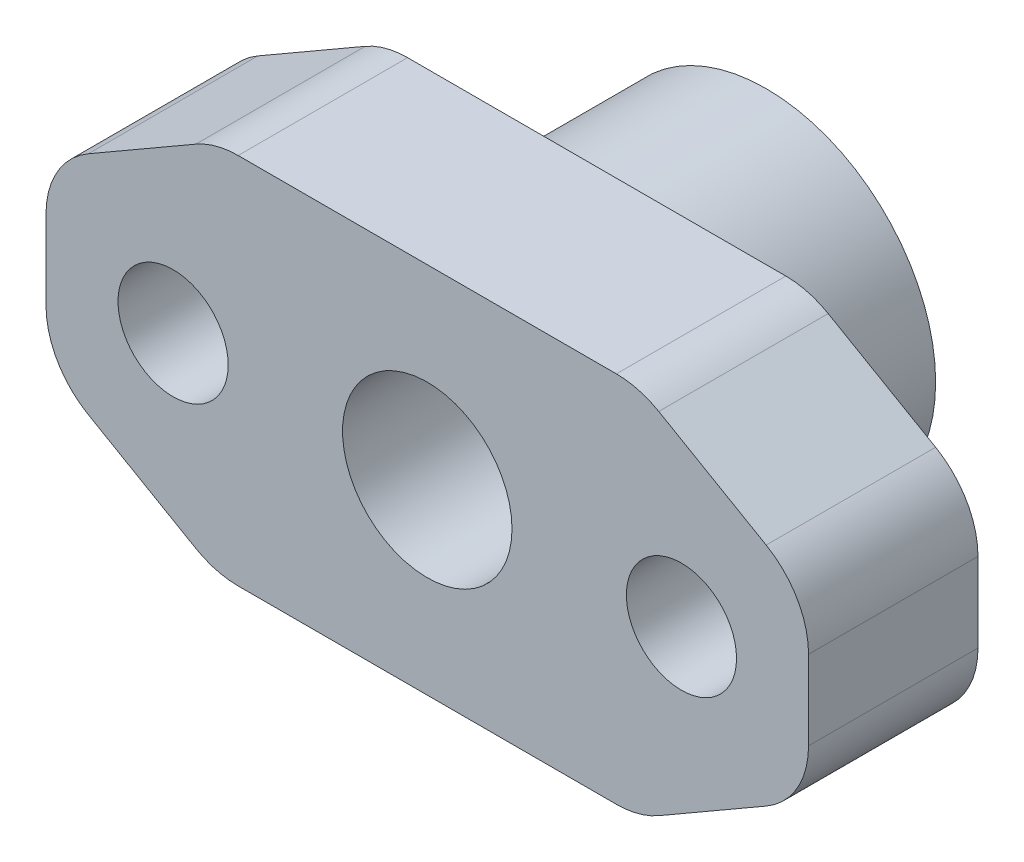
ISO-10303-21;
HEADER;
FILE_DESCRIPTION(('STEP AP214'),'2;1');
FILE_NAME('part.step','',(''),(''),'','','');
FILE_SCHEMA(('AUTOMOTIVE_DESIGN { 1 0 10303 214 1 1 1 1 }'));
ENDSEC;
DATA;
#1=APPLICATION_CONTEXT('core data for automotive mechanical design processes');
#2=APPLICATION_PROTOCOL_DEFINITION('international standard','automotive_design',2000,#1);
#3=PRODUCT_CONTEXT('',#1,'mechanical');
#4=PRODUCT('Part','Part','',(#3));
#5=PRODUCT_RELATED_PRODUCT_CATEGORY('part','',(#4));
#6=PRODUCT_DEFINITION_FORMATION('','',#4);
#7=PRODUCT_DEFINITION_CONTEXT('part definition',#1,'design');
#8=PRODUCT_DEFINITION('design','',#6,#7);
#9=PRODUCT_DEFINITION_SHAPE('','',#8);
#10=(LENGTH_UNIT() NAMED_UNIT(*) SI_UNIT(.MILLI.,.METRE.));
#11=(NAMED_UNIT(*) PLANE_ANGLE_UNIT() SI_UNIT($,.RADIAN.));
#12=(NAMED_UNIT(*) SI_UNIT($,.STERADIAN.) SOLID_ANGLE_UNIT());
#13=UNCERTAINTY_MEASURE_WITH_UNIT(LENGTH_MEASURE(1.E-05),#10,'distance_accuracy_value','');
#14=(GEOMETRIC_REPRESENTATION_CONTEXT(3) GLOBAL_UNCERTAINTY_ASSIGNED_CONTEXT((#13)) GLOBAL_UNIT_ASSIGNED_CONTEXT((#10,
#11,#12)) REPRESENTATION_CONTEXT('',''));
#15=CARTESIAN_POINT('',(0.,0.,0.));
#16=DIRECTION('',(0.,0.,1.));
#17=DIRECTION('',(1.,0.,0.));
#18=AXIS2_PLACEMENT_3D('',#15,#16,#17);
#19=CARTESIAN_POINT('',(0.,0.,20.));
#20=DIRECTION('',(0.,0.,-1.));
#21=DIRECTION('',(-1.,0.,0.));
#22=AXIS2_PLACEMENT_3D('',#19,#20,#21);
#23=CYLINDRICAL_SURFACE('',#22,10.);
#24=CARTESIAN_POINT('',(0.,0.,0.));
#25=DIRECTION('',(0.,0.,1.));
#26=DIRECTION('',(1.,0.,0.));
#27=AXIS2_PLACEMENT_3D('',#24,#25,#26);
#28=CIRCLE('',#27,10.);
#29=CARTESIAN_POINT('',(10.,0.,0.));
#30=VERTEX_POINT('',#29);
#31=EDGE_CURVE('E177',#30,#30,#28,.T.);
#32=ORIENTED_EDGE('',*,*,#31,.T.);
#33=EDGE_LOOP('',(#32));
#34=FACE_BOUND('',#33,.T.);
#35=CARTESIAN_POINT('',(0.,0.,10.));
#36=DIRECTION('',(0.,0.,1.));
#37=DIRECTION('',(1.,0.,0.));
#38=AXIS2_PLACEMENT_3D('',#35,#36,#37);
#39=CIRCLE('',#38,10.);
#40=CARTESIAN_POINT('',(10.,0.,10.));
#41=VERTEX_POINT('',#40);
#42=EDGE_CURVE('E172',#41,#41,#39,.T.);
#43=ORIENTED_EDGE('',*,*,#42,.F.);
#44=EDGE_LOOP('',(#43));
#45=FACE_BOUND('',#44,.T.);
#46=ADVANCED_FACE('F33',(#34,#45),#23,.T.);
#47=CARTESIAN_POINT('',(0.,0.,20.));
#48=DIRECTION('',(0.,0.,1.));
#49=DIRECTION('',(1.,0.,0.));
#50=AXIS2_PLACEMENT_3D('',#47,#48,#49);
#51=PLANE('',#50);
#52=CARTESIAN_POINT('',(15.,0.,20.));
#53=DIRECTION('',(0.,0.,1.));
#54=DIRECTION('',(1.,0.,0.));
#55=AXIS2_PLACEMENT_3D('',#52,#53,#54);
#56=CIRCLE('',#55,3.25);
#57=CARTESIAN_POINT('',(18.25,0.,20.));
#58=VERTEX_POINT('',#57);
#59=EDGE_CURVE('E251',#58,#58,#56,.T.);
#60=ORIENTED_EDGE('',*,*,#59,.F.);
#61=EDGE_LOOP('',(#60));
#62=FACE_BOUND('',#61,.T.);
#63=CARTESIAN_POINT('',(-15.,0.,20.));
#64=DIRECTION('',(0.,0.,1.));
#65=DIRECTION('',(1.,0.,0.));
#66=AXIS2_PLACEMENT_3D('',#63,#64,#65);
#67=CIRCLE('',#66,3.25);
#68=CARTESIAN_POINT('',(-11.75,0.,20.));
#69=VERTEX_POINT('',#68);
#70=EDGE_CURVE('E274',#69,#69,#67,.T.);
#71=ORIENTED_EDGE('',*,*,#70,.F.);
#72=EDGE_LOOP('',(#71));
#73=FACE_BOUND('',#72,.T.);
#74=CARTESIAN_POINT('',(0.,0.,20.));
#75=DIRECTION('',(0.,0.,1.));
#76=DIRECTION('',(1.,0.,0.));
#77=AXIS2_PLACEMENT_3D('',#74,#75,#76);
#78=CIRCLE('',#77,5.);
#79=CARTESIAN_POINT('',(5.,0.,20.));
#80=VERTEX_POINT('',#79);
#81=EDGE_CURVE('E264',#80,#80,#78,.T.);
#82=ORIENTED_EDGE('',*,*,#81,.F.);
#83=EDGE_LOOP('',(#82));
#84=FACE_BOUND('',#83,.T.);
#85=DIRECTION('',(1.,0.,0.));
#86=VECTOR('',#85,1.);
#87=CARTESIAN_POINT('',(12.5,-11.,20.));
#88=LINE('',#87,#86);
#89=CARTESIAN_POINT('',(-11.1602540378444,-11.,20.));
#90=VERTEX_POINT('',#89);
#91=CARTESIAN_POINT('',(11.1602540378444,-11.,20.));
#92=VERTEX_POINT('',#91);
#93=EDGE_CURVE('E149',#90,#92,#88,.T.);
#94=ORIENTED_EDGE('',*,*,#93,.T.);
#95=CARTESIAN_POINT('',(11.1602540378444,-5.99999999999999,20.));
#96=DIRECTION('',(0.,0.,1.));
#97=DIRECTION('',(1.,0.,0.));
#98=AXIS2_PLACEMENT_3D('',#95,#96,#97);
#99=CIRCLE('',#98,5.);
#100=CARTESIAN_POINT('',(13.6602540378444,-10.3301270189222,20.));
#101=VERTEX_POINT('',#100);
#102=EDGE_CURVE('E156',#92,#101,#99,.T.);
#103=ORIENTED_EDGE('',*,*,#102,.T.);
#104=DIRECTION('',(0.86602540378444,0.499999999999998,0.));
#105=VECTOR('',#104,1.);
#106=CARTESIAN_POINT('',(22.5,-5.22649730810377,20.));
#107=LINE('',#106,#105);
#108=CARTESIAN_POINT('',(20.,-6.66987298107783,20.));
#109=VERTEX_POINT('',#108);
#110=EDGE_CURVE('E247',#101,#109,#107,.T.);
#111=ORIENTED_EDGE('',*,*,#110,.T.);
#112=CARTESIAN_POINT('',(17.5,-2.33974596215563,20.));
#113=DIRECTION('',(0.,0.,1.));
#114=DIRECTION('',(1.,0.,0.));
#115=AXIS2_PLACEMENT_3D('',#112,#113,#114);
#116=CIRCLE('',#115,5.);
#117=CARTESIAN_POINT('',(22.5,-2.33974596215563,20.));
#118=VERTEX_POINT('',#117);
#119=EDGE_CURVE('E184',#109,#118,#116,.T.);
#120=ORIENTED_EDGE('',*,*,#119,.T.);
#121=DIRECTION('',(0.,1.,0.));
#122=VECTOR('',#121,1.);
#123=CARTESIAN_POINT('',(22.5,-5.22649730810377,20.));
#124=LINE('',#123,#122);
#125=CARTESIAN_POINT('',(22.5,2.33974596215563,20.));
#126=VERTEX_POINT('',#125);
#127=EDGE_CURVE('E240',#118,#126,#124,.T.);
#128=ORIENTED_EDGE('',*,*,#127,.T.);
#129=CARTESIAN_POINT('',(17.5,2.33974596215563,20.));
#130=DIRECTION('',(0.,0.,1.));
#131=DIRECTION('',(1.,0.,0.));
#132=AXIS2_PLACEMENT_3D('',#129,#130,#131);
#133=CIRCLE('',#132,5.);
#134=CARTESIAN_POINT('',(20.,6.66987298107783,20.));
#135=VERTEX_POINT('',#134);
#136=EDGE_CURVE('E174',#126,#135,#133,.T.);
#137=ORIENTED_EDGE('',*,*,#136,.T.);
#138=DIRECTION('',(-0.86602540378444,0.499999999999998,0.));
#139=VECTOR('',#138,1.);
#140=CARTESIAN_POINT('',(22.5,5.22649730810377,20.));
#141=LINE('',#140,#139);
#142=CARTESIAN_POINT('',(13.6602540378444,10.3301270189222,20.));
#143=VERTEX_POINT('',#142);
#144=EDGE_CURVE('E246',#135,#143,#141,.T.);
#145=ORIENTED_EDGE('',*,*,#144,.T.);
#146=CARTESIAN_POINT('',(11.1602540378444,5.99999999999999,20.));
#147=DIRECTION('',(0.,0.,1.));
#148=DIRECTION('',(1.,0.,0.));
#149=AXIS2_PLACEMENT_3D('',#146,#147,#148);
#150=CIRCLE('',#149,5.);
#151=CARTESIAN_POINT('',(11.1602540378444,11.,20.));
#152=VERTEX_POINT('',#151);
#153=EDGE_CURVE('E190',#143,#152,#150,.T.);
#154=ORIENTED_EDGE('',*,*,#153,.T.);
#155=DIRECTION('',(-1.,0.,0.));
#156=VECTOR('',#155,1.);
#157=CARTESIAN_POINT('',(12.5,11.,20.));
#158=LINE('',#157,#156);
#159=CARTESIAN_POINT('',(-11.1602540378444,11.,20.));
#160=VERTEX_POINT('',#159);
#161=EDGE_CURVE('E249',#152,#160,#158,.T.);
#162=ORIENTED_EDGE('',*,*,#161,.T.);
#163=CARTESIAN_POINT('',(-11.1602540378444,6.,20.));
#164=DIRECTION('',(0.,0.,1.));
#165=DIRECTION('',(1.,0.,0.));
#166=AXIS2_PLACEMENT_3D('',#163,#164,#165);
#167=CIRCLE('',#166,5.);
#168=CARTESIAN_POINT('',(-13.6602540378444,10.3301270189222,20.));
#169=VERTEX_POINT('',#168);
#170=EDGE_CURVE('E157',#160,#169,#167,.T.);
#171=ORIENTED_EDGE('',*,*,#170,.T.);
#172=DIRECTION('',(-0.86602540378444,-0.499999999999998,0.));
#173=VECTOR('',#172,1.);
#174=CARTESIAN_POINT('',(-22.5,5.22649730810378,20.));
#175=LINE('',#174,#173);
#176=CARTESIAN_POINT('',(-20.,6.66987298107784,20.));
#177=VERTEX_POINT('',#176);
#178=EDGE_CURVE('E257',#169,#177,#175,.T.);
#179=ORIENTED_EDGE('',*,*,#178,.T.);
#180=CARTESIAN_POINT('',(-17.5,2.33974596215564,20.));
#181=DIRECTION('',(0.,0.,1.));
#182=DIRECTION('',(1.,0.,0.));
#183=AXIS2_PLACEMENT_3D('',#180,#181,#182);
#184=CIRCLE('',#183,5.);
#185=CARTESIAN_POINT('',(-22.5,2.33974596215564,20.));
#186=VERTEX_POINT('',#185);
#187=EDGE_CURVE('E188',#177,#186,#184,.T.);
#188=ORIENTED_EDGE('',*,*,#187,.T.);
#189=DIRECTION('',(0.,-1.,0.));
#190=VECTOR('',#189,1.);
#191=CARTESIAN_POINT('',(-22.5,-5.22649730810378,20.));
#192=LINE('',#191,#190);
#193=CARTESIAN_POINT('',(-22.5,-2.33974596215564,20.));
#194=VERTEX_POINT('',#193);
#195=EDGE_CURVE('E260',#186,#194,#192,.T.);
#196=ORIENTED_EDGE('',*,*,#195,.T.);
#197=CARTESIAN_POINT('',(-17.5,-2.33974596215564,20.));
#198=DIRECTION('',(0.,0.,1.));
#199=DIRECTION('',(1.,0.,0.));
#200=AXIS2_PLACEMENT_3D('',#197,#198,#199);
#201=CIRCLE('',#200,5.);
#202=CARTESIAN_POINT('',(-20.,-6.66987298107784,20.));
#203=VERTEX_POINT('',#202);
#204=EDGE_CURVE('E186',#194,#203,#201,.T.);
#205=ORIENTED_EDGE('',*,*,#204,.T.);
#206=DIRECTION('',(0.86602540378444,-0.499999999999998,0.));
#207=VECTOR('',#206,1.);
#208=CARTESIAN_POINT('',(-22.5,-5.22649730810378,20.));
#209=LINE('',#208,#207);
#210=CARTESIAN_POINT('',(-13.6602540378444,-10.3301270189222,20.));
#211=VERTEX_POINT('',#210);
#212=EDGE_CURVE('E151',#203,#211,#209,.T.);
#213=ORIENTED_EDGE('',*,*,#212,.T.);
#214=CARTESIAN_POINT('',(-11.1602540378444,-6.,20.));
#215=DIRECTION('',(0.,0.,1.));
#216=DIRECTION('',(1.,0.,0.));
#217=AXIS2_PLACEMENT_3D('',#214,#215,#216);
#218=CIRCLE('',#217,5.);
#219=EDGE_CURVE('E146',#211,#90,#218,.T.);
#220=ORIENTED_EDGE('',*,*,#219,.T.);
#221=EDGE_LOOP('',(#94,#103,#111,#120,#128,#137,#145,#154,#162,#171,#179,#188,#196,#205,#213,#220));
#222=FACE_BOUND('',#221,.T.);
#223=ADVANCED_FACE('F148',(#62,#73,#84,#222),#51,.T.);
#224=CARTESIAN_POINT('',(0.,0.,0.));
#225=DIRECTION('',(0.,0.,1.));
#226=DIRECTION('',(1.,0.,0.));
#227=AXIS2_PLACEMENT_3D('',#224,#225,#226);
#228=PLANE('',#227);
#229=ORIENTED_EDGE('',*,*,#31,.F.);
#230=EDGE_LOOP('',(#229));
#231=FACE_BOUND('',#230,.T.);
#232=CARTESIAN_POINT('',(0.,0.,0.));
#233=DIRECTION('',(0.,0.,1.));
#234=DIRECTION('',(1.,0.,0.));
#235=AXIS2_PLACEMENT_3D('',#232,#233,#234);
#236=CIRCLE('',#235,5.);
#237=CARTESIAN_POINT('',(5.,0.,0.));
#238=VERTEX_POINT('',#237);
#239=EDGE_CURVE('E267',#238,#238,#236,.T.);
#240=ORIENTED_EDGE('',*,*,#239,.T.);
#241=EDGE_LOOP('',(#240));
#242=FACE_BOUND('',#241,.T.);
#243=ADVANCED_FACE('F328',(#231,#242),#228,.F.);
#244=CARTESIAN_POINT('',(0.,0.,20.));
#245=DIRECTION('',(0.,0.,-1.));
#246=DIRECTION('',(-1.,0.,0.));
#247=AXIS2_PLACEMENT_3D('',#244,#245,#246);
#248=CYLINDRICAL_SURFACE('',#247,5.);
#249=ORIENTED_EDGE('',*,*,#81,.T.);
#250=EDGE_LOOP('',(#249));
#251=FACE_BOUND('',#250,.T.);
#252=ORIENTED_EDGE('',*,*,#239,.F.);
#253=EDGE_LOOP('',(#252));
#254=FACE_BOUND('',#253,.T.);
#255=ADVANCED_FACE('F317',(#251,#254),#248,.F.);
#256=CARTESIAN_POINT('',(0.,0.,10.));
#257=DIRECTION('',(0.,0.,1.));
#258=DIRECTION('',(1.,0.,0.));
#259=AXIS2_PLACEMENT_3D('',#256,#257,#258);
#260=PLANE('',#259);
#261=CARTESIAN_POINT('',(15.,0.,10.));
#262=DIRECTION('',(0.,0.,1.));
#263=DIRECTION('',(1.,0.,0.));
#264=AXIS2_PLACEMENT_3D('',#261,#262,#263);
#265=CIRCLE('',#264,3.25);
#266=CARTESIAN_POINT('',(18.25,0.,10.));
#267=VERTEX_POINT('',#266);
#268=EDGE_CURVE('E180',#267,#267,#265,.T.);
#269=ORIENTED_EDGE('',*,*,#268,.T.);
#270=EDGE_LOOP('',(#269));
#271=FACE_BOUND('',#270,.T.);
#272=CARTESIAN_POINT('',(-15.,0.,10.));
#273=DIRECTION('',(0.,0.,1.));
#274=DIRECTION('',(1.,0.,0.));
#275=AXIS2_PLACEMENT_3D('',#272,#273,#274);
#276=CIRCLE('',#275,3.25);
#277=CARTESIAN_POINT('',(-11.75,0.,10.));
#278=VERTEX_POINT('',#277);
#279=EDGE_CURVE('E272',#278,#278,#276,.T.);
#280=ORIENTED_EDGE('',*,*,#279,.T.);
#281=EDGE_LOOP('',(#280));
#282=FACE_BOUND('',#281,.T.);
#283=DIRECTION('',(0.86602540378444,0.499999999999998,0.));
#284=VECTOR('',#283,1.);
#285=CARTESIAN_POINT('',(22.5,-5.22649730810377,10.));
#286=LINE('',#285,#284);
#287=CARTESIAN_POINT('',(13.6602540378444,-10.3301270189222,10.));
#288=VERTEX_POINT('',#287);
#289=CARTESIAN_POINT('',(20.,-6.66987298107783,10.));
#290=VERTEX_POINT('',#289);
#291=EDGE_CURVE('E167',#288,#290,#286,.T.);
#292=ORIENTED_EDGE('',*,*,#291,.F.);
#293=CARTESIAN_POINT('',(11.1602540378444,-5.99999999999999,10.));
#294=DIRECTION('',(0.,0.,1.));
#295=DIRECTION('',(1.,0.,0.));
#296=AXIS2_PLACEMENT_3D('',#293,#294,#295);
#297=CIRCLE('',#296,5.);
#298=CARTESIAN_POINT('',(11.1602540378444,-11.,10.));
#299=VERTEX_POINT('',#298);
#300=EDGE_CURVE('E211',#288,#299,#297,.F.);
#301=ORIENTED_EDGE('',*,*,#300,.T.);
#302=DIRECTION('',(1.,0.,0.));
#303=VECTOR('',#302,1.);
#304=CARTESIAN_POINT('',(12.5,-11.,10.));
#305=LINE('',#304,#303);
#306=CARTESIAN_POINT('',(-11.1602540378444,-11.,10.));
#307=VERTEX_POINT('',#306);
#308=EDGE_CURVE('E270',#307,#299,#305,.T.);
#309=ORIENTED_EDGE('',*,*,#308,.F.);
#310=CARTESIAN_POINT('',(-11.1602540378444,-6.,10.));
#311=DIRECTION('',(0.,0.,1.));
#312=DIRECTION('',(1.,0.,0.));
#313=AXIS2_PLACEMENT_3D('',#310,#311,#312);
#314=CIRCLE('',#313,5.);
#315=CARTESIAN_POINT('',(-13.6602540378444,-10.3301270189222,10.));
#316=VERTEX_POINT('',#315);
#317=EDGE_CURVE('E171',#307,#316,#314,.F.);
#318=ORIENTED_EDGE('',*,*,#317,.T.);
#319=DIRECTION('',(0.86602540378444,-0.499999999999998,0.));
#320=VECTOR('',#319,1.);
#321=CARTESIAN_POINT('',(-22.5,-5.22649730810378,10.));
#322=LINE('',#321,#320);
#323=CARTESIAN_POINT('',(-20.,-6.66987298107784,10.));
#324=VERTEX_POINT('',#323);
#325=EDGE_CURVE('E300',#324,#316,#322,.T.);
#326=ORIENTED_EDGE('',*,*,#325,.F.);
#327=CARTESIAN_POINT('',(-17.5,-2.33974596215564,10.));
#328=DIRECTION('',(0.,0.,1.));
#329=DIRECTION('',(1.,0.,0.));
#330=AXIS2_PLACEMENT_3D('',#327,#328,#329);
#331=CIRCLE('',#330,5.);
#332=CARTESIAN_POINT('',(-22.5,-2.33974596215564,10.));
#333=VERTEX_POINT('',#332);
#334=EDGE_CURVE('E202',#324,#333,#331,.F.);
#335=ORIENTED_EDGE('',*,*,#334,.T.);
#336=DIRECTION('',(0.,-1.,0.));
#337=VECTOR('',#336,1.);
#338=CARTESIAN_POINT('',(-22.5,-5.22649730810378,10.));
#339=LINE('',#338,#337);
#340=CARTESIAN_POINT('',(-22.5,2.33974596215564,10.));
#341=VERTEX_POINT('',#340);
#342=EDGE_CURVE('E297',#341,#333,#339,.T.);
#343=ORIENTED_EDGE('',*,*,#342,.F.);
#344=CARTESIAN_POINT('',(-17.5,2.33974596215564,10.));
#345=DIRECTION('',(0.,0.,1.));
#346=DIRECTION('',(1.,0.,0.));
#347=AXIS2_PLACEMENT_3D('',#344,#345,#346);
#348=CIRCLE('',#347,5.);
#349=CARTESIAN_POINT('',(-20.,6.66987298107784,10.));
#350=VERTEX_POINT('',#349);
#351=EDGE_CURVE('E204',#341,#350,#348,.F.);
#352=ORIENTED_EDGE('',*,*,#351,.T.);
#353=DIRECTION('',(-0.86602540378444,-0.499999999999998,0.));
#354=VECTOR('',#353,1.);
#355=CARTESIAN_POINT('',(-22.5,5.22649730810378,10.));
#356=LINE('',#355,#354);
#357=CARTESIAN_POINT('',(-13.6602540378444,10.3301270189222,10.));
#358=VERTEX_POINT('',#357);
#359=EDGE_CURVE('E294',#358,#350,#356,.T.);
#360=ORIENTED_EDGE('',*,*,#359,.F.);
#361=CARTESIAN_POINT('',(-11.1602540378444,6.,10.));
#362=DIRECTION('',(0.,0.,1.));
#363=DIRECTION('',(1.,0.,0.));
#364=AXIS2_PLACEMENT_3D('',#361,#362,#363);
#365=CIRCLE('',#364,5.);
#366=CARTESIAN_POINT('',(-11.1602540378444,11.,10.));
#367=VERTEX_POINT('',#366);
#368=EDGE_CURVE('E208',#358,#367,#365,.F.);
#369=ORIENTED_EDGE('',*,*,#368,.T.);
#370=DIRECTION('',(-1.,0.,0.));
#371=VECTOR('',#370,1.);
#372=CARTESIAN_POINT('',(12.5,11.,10.));
#373=LINE('',#372,#371);
#374=CARTESIAN_POINT('',(11.1602540378444,11.,10.));
#375=VERTEX_POINT('',#374);
#376=EDGE_CURVE('E291',#375,#367,#373,.T.);
#377=ORIENTED_EDGE('',*,*,#376,.F.);
#378=CARTESIAN_POINT('',(11.1602540378444,5.99999999999999,10.));
#379=DIRECTION('',(0.,0.,1.));
#380=DIRECTION('',(1.,0.,0.));
#381=AXIS2_PLACEMENT_3D('',#378,#379,#380);
#382=CIRCLE('',#381,5.);
#383=CARTESIAN_POINT('',(13.6602540378444,10.3301270189222,10.));
#384=VERTEX_POINT('',#383);
#385=EDGE_CURVE('E206',#375,#384,#382,.F.);
#386=ORIENTED_EDGE('',*,*,#385,.T.);
#387=DIRECTION('',(-0.86602540378444,0.499999999999998,0.));
#388=VECTOR('',#387,1.);
#389=CARTESIAN_POINT('',(22.5,5.22649730810377,10.));
#390=LINE('',#389,#388);
#391=CARTESIAN_POINT('',(20.,6.66987298107783,10.));
#392=VERTEX_POINT('',#391);
#393=EDGE_CURVE('E288',#392,#384,#390,.T.);
#394=ORIENTED_EDGE('',*,*,#393,.F.);
#395=CARTESIAN_POINT('',(17.5,2.33974596215563,10.));
#396=DIRECTION('',(0.,0.,1.));
#397=DIRECTION('',(1.,0.,0.));
#398=AXIS2_PLACEMENT_3D('',#395,#396,#397);
#399=CIRCLE('',#398,5.);
#400=CARTESIAN_POINT('',(22.5,2.33974596215563,10.));
#401=VERTEX_POINT('',#400);
#402=EDGE_CURVE('E48',#392,#401,#399,.F.);
#403=ORIENTED_EDGE('',*,*,#402,.T.);
#404=DIRECTION('',(0.,1.,0.));
#405=VECTOR('',#404,1.);
#406=CARTESIAN_POINT('',(22.5,-5.22649730810377,10.));
#407=LINE('',#406,#405);
#408=CARTESIAN_POINT('',(22.5,-2.33974596215563,10.));
#409=VERTEX_POINT('',#408);
#410=EDGE_CURVE('E241',#409,#401,#407,.T.);
#411=ORIENTED_EDGE('',*,*,#410,.F.);
#412=CARTESIAN_POINT('',(17.5,-2.33974596215563,10.));
#413=DIRECTION('',(0.,0.,1.));
#414=DIRECTION('',(1.,0.,0.));
#415=AXIS2_PLACEMENT_3D('',#412,#413,#414);
#416=CIRCLE('',#415,5.);
#417=EDGE_CURVE('E200',#409,#290,#416,.F.);
#418=ORIENTED_EDGE('',*,*,#417,.T.);
#419=EDGE_LOOP('',(#292,#301,#309,#318,#326,#335,#343,#352,#360,#369,#377,#386,#394,#403,#411,#418));
#420=FACE_BOUND('',#419,.T.);
#421=ORIENTED_EDGE('',*,*,#42,.T.);
#422=EDGE_LOOP('',(#421));
#423=FACE_BOUND('',#422,.T.);
#424=ADVANCED_FACE('F314',(#271,#282,#420,#423),#260,.F.);
#425=CARTESIAN_POINT('',(22.5,-5.22649730810377,10.));
#426=DIRECTION('',(0.499999999999998,-0.86602540378444,0.));
#427=DIRECTION('',(0.86602540378444,0.499999999999998,0.));
#428=AXIS2_PLACEMENT_3D('',#425,#426,#427);
#429=PLANE('',#428);
#430=ORIENTED_EDGE('',*,*,#110,.F.);
#431=DIRECTION('',(0.,0.,1.));
#432=VECTOR('',#431,1.);
#433=CARTESIAN_POINT('',(13.6602540378444,-10.3301270189222,10.));
#434=LINE('',#433,#432);
#435=EDGE_CURVE('E197',#101,#288,#434,.F.);
#436=ORIENTED_EDGE('',*,*,#435,.T.);
#437=ORIENTED_EDGE('',*,*,#291,.T.);
#438=DIRECTION('',(0.,0.,1.));
#439=VECTOR('',#438,1.);
#440=CARTESIAN_POINT('',(20.,-6.66987298107783,10.));
#441=LINE('',#440,#439);
#442=EDGE_CURVE('E194',#290,#109,#441,.T.);
#443=ORIENTED_EDGE('',*,*,#442,.T.);
#444=EDGE_LOOP('',(#430,#436,#437,#443));
#445=FACE_BOUND('',#444,.T.);
#446=ADVANCED_FACE('F308',(#445),#429,.T.);
#447=CARTESIAN_POINT('',(12.5,-11.,10.));
#448=DIRECTION('',(0.,-1.,0.));
#449=DIRECTION('',(1.,0.,0.));
#450=AXIS2_PLACEMENT_3D('',#447,#448,#449);
#451=PLANE('',#450);
#452=ORIENTED_EDGE('',*,*,#308,.T.);
#453=DIRECTION('',(0.,0.,1.));
#454=VECTOR('',#453,1.);
#455=CARTESIAN_POINT('',(11.1602540378444,-11.,10.));
#456=LINE('',#455,#454);
#457=EDGE_CURVE('E166',#299,#92,#456,.T.);
#458=ORIENTED_EDGE('',*,*,#457,.T.);
#459=ORIENTED_EDGE('',*,*,#93,.F.);
#460=DIRECTION('',(0.,0.,1.));
#461=VECTOR('',#460,1.);
#462=CARTESIAN_POINT('',(-11.1602540378444,-11.,10.));
#463=LINE('',#462,#461);
#464=EDGE_CURVE('E163',#90,#307,#463,.F.);
#465=ORIENTED_EDGE('',*,*,#464,.T.);
#466=EDGE_LOOP('',(#452,#458,#459,#465));
#467=FACE_BOUND('',#466,.T.);
#468=ADVANCED_FACE('F162',(#467),#451,.T.);
#469=CARTESIAN_POINT('',(-22.5,-5.22649730810378,10.));
#470=DIRECTION('',(-0.499999999999998,-0.86602540378444,0.));
#471=DIRECTION('',(0.86602540378444,-0.499999999999998,0.));
#472=AXIS2_PLACEMENT_3D('',#469,#470,#471);
#473=PLANE('',#472);
#474=ORIENTED_EDGE('',*,*,#325,.T.);
#475=DIRECTION('',(0.,0.,1.));
#476=VECTOR('',#475,1.);
#477=CARTESIAN_POINT('',(-13.6602540378444,-10.3301270189222,10.));
#478=LINE('',#477,#476);
#479=EDGE_CURVE('E215',#316,#211,#478,.T.);
#480=ORIENTED_EDGE('',*,*,#479,.T.);
#481=ORIENTED_EDGE('',*,*,#212,.F.);
#482=DIRECTION('',(0.,0.,1.));
#483=VECTOR('',#482,1.);
#484=CARTESIAN_POINT('',(-20.,-6.66987298107784,10.));
#485=LINE('',#484,#483);
#486=EDGE_CURVE('E213',#203,#324,#485,.F.);
#487=ORIENTED_EDGE('',*,*,#486,.T.);
#488=EDGE_LOOP('',(#474,#480,#481,#487));
#489=FACE_BOUND('',#488,.T.);
#490=ADVANCED_FACE('F387',(#489),#473,.T.);
#491=CARTESIAN_POINT('',(-22.5,-5.22649730810378,10.));
#492=DIRECTION('',(-1.,0.,0.));
#493=DIRECTION('',(0.,0.,1.));
#494=AXIS2_PLACEMENT_3D('',#491,#492,#493);
#495=PLANE('',#494);
#496=ORIENTED_EDGE('',*,*,#195,.F.);
#497=DIRECTION('',(0.,0.,1.));
#498=VECTOR('',#497,1.);
#499=CARTESIAN_POINT('',(-22.5,2.33974596215564,10.));
#500=LINE('',#499,#498);
#501=EDGE_CURVE('E235',#186,#341,#500,.F.);
#502=ORIENTED_EDGE('',*,*,#501,.T.);
#503=ORIENTED_EDGE('',*,*,#342,.T.);
#504=DIRECTION('',(0.,0.,1.));
#505=VECTOR('',#504,1.);
#506=CARTESIAN_POINT('',(-22.5,-2.33974596215564,10.));
#507=LINE('',#506,#505);
#508=EDGE_CURVE('E232',#333,#194,#507,.T.);
#509=ORIENTED_EDGE('',*,*,#508,.T.);
#510=EDGE_LOOP('',(#496,#502,#503,#509));
#511=FACE_BOUND('',#510,.T.);
#512=ADVANCED_FACE('F381',(#511),#495,.T.);
#513=CARTESIAN_POINT('',(-22.5,5.22649730810378,10.));
#514=DIRECTION('',(-0.499999999999998,0.86602540378444,0.));
#515=DIRECTION('',(-0.86602540378444,-0.499999999999998,0.));
#516=AXIS2_PLACEMENT_3D('',#513,#514,#515);
#517=PLANE('',#516);
#518=ORIENTED_EDGE('',*,*,#178,.F.);
#519=DIRECTION('',(0.,0.,1.));
#520=VECTOR('',#519,1.);
#521=CARTESIAN_POINT('',(-13.6602540378444,10.3301270189222,10.));
#522=LINE('',#521,#520);
#523=EDGE_CURVE('E225',#169,#358,#522,.F.);
#524=ORIENTED_EDGE('',*,*,#523,.T.);
#525=ORIENTED_EDGE('',*,*,#359,.T.);
#526=DIRECTION('',(0.,0.,1.));
#527=VECTOR('',#526,1.);
#528=CARTESIAN_POINT('',(-20.,6.66987298107784,10.));
#529=LINE('',#528,#527);
#530=EDGE_CURVE('E222',#350,#177,#529,.T.);
#531=ORIENTED_EDGE('',*,*,#530,.T.);
#532=EDGE_LOOP('',(#518,#524,#525,#531));
#533=FACE_BOUND('',#532,.T.);
#534=ADVANCED_FACE('F374',(#533),#517,.T.);
#535=CARTESIAN_POINT('',(12.5,11.,10.));
#536=DIRECTION('',(0.,1.,0.));
#537=DIRECTION('',(-1.,0.,0.));
#538=AXIS2_PLACEMENT_3D('',#535,#536,#537);
#539=PLANE('',#538);
#540=ORIENTED_EDGE('',*,*,#376,.T.);
#541=DIRECTION('',(0.,0.,1.));
#542=VECTOR('',#541,1.);
#543=CARTESIAN_POINT('',(-11.1602540378444,11.,10.));
#544=LINE('',#543,#542);
#545=EDGE_CURVE('E219',#367,#160,#544,.T.);
#546=ORIENTED_EDGE('',*,*,#545,.T.);
#547=ORIENTED_EDGE('',*,*,#161,.F.);
#548=DIRECTION('',(0.,0.,1.));
#549=VECTOR('',#548,1.);
#550=CARTESIAN_POINT('',(11.1602540378444,11.,10.));
#551=LINE('',#550,#549);
#552=EDGE_CURVE('E217',#152,#375,#551,.F.);
#553=ORIENTED_EDGE('',*,*,#552,.T.);
#554=EDGE_LOOP('',(#540,#546,#547,#553));
#555=FACE_BOUND('',#554,.T.);
#556=ADVANCED_FACE('F368',(#555),#539,.T.);
#557=CARTESIAN_POINT('',(22.5,5.22649730810377,10.));
#558=DIRECTION('',(0.499999999999998,0.86602540378444,0.));
#559=DIRECTION('',(-0.86602540378444,0.499999999999998,0.));
#560=AXIS2_PLACEMENT_3D('',#557,#558,#559);
#561=PLANE('',#560);
#562=ORIENTED_EDGE('',*,*,#393,.T.);
#563=DIRECTION('',(0.,0.,1.));
#564=VECTOR('',#563,1.);
#565=CARTESIAN_POINT('',(13.6602540378444,10.3301270189222,10.));
#566=LINE('',#565,#564);
#567=EDGE_CURVE('E229',#384,#143,#566,.T.);
#568=ORIENTED_EDGE('',*,*,#567,.T.);
#569=ORIENTED_EDGE('',*,*,#144,.F.);
#570=DIRECTION('',(0.,0.,1.));
#571=VECTOR('',#570,1.);
#572=CARTESIAN_POINT('',(20.,6.66987298107783,10.));
#573=LINE('',#572,#571);
#574=EDGE_CURVE('E227',#135,#392,#573,.F.);
#575=ORIENTED_EDGE('',*,*,#574,.T.);
#576=EDGE_LOOP('',(#562,#568,#569,#575));
#577=FACE_BOUND('',#576,.T.);
#578=ADVANCED_FACE('F361',(#577),#561,.T.);
#579=CARTESIAN_POINT('',(22.5,-5.22649730810377,10.));
#580=DIRECTION('',(1.,0.,0.));
#581=DIRECTION('',(0.,0.,-1.));
#582=AXIS2_PLACEMENT_3D('',#579,#580,#581);
#583=PLANE('',#582);
#584=ORIENTED_EDGE('',*,*,#127,.F.);
#585=DIRECTION('',(0.,0.,1.));
#586=VECTOR('',#585,1.);
#587=CARTESIAN_POINT('',(22.5,-2.33974596215563,10.));
#588=LINE('',#587,#586);
#589=EDGE_CURVE('E11',#118,#409,#588,.F.);
#590=ORIENTED_EDGE('',*,*,#589,.T.);
#591=ORIENTED_EDGE('',*,*,#410,.T.);
#592=DIRECTION('',(0.,0.,1.));
#593=VECTOR('',#592,1.);
#594=CARTESIAN_POINT('',(22.5,2.33974596215563,10.));
#595=LINE('',#594,#593);
#596=EDGE_CURVE('E41',#401,#126,#595,.T.);
#597=ORIENTED_EDGE('',*,*,#596,.T.);
#598=EDGE_LOOP('',(#584,#590,#591,#597));
#599=FACE_BOUND('',#598,.T.);
#600=ADVANCED_FACE('F239',(#599),#583,.T.);
#601=CARTESIAN_POINT('',(-15.,0.,0.));
#602=DIRECTION('',(0.,0.,1.));
#603=DIRECTION('',(1.,0.,0.));
#604=AXIS2_PLACEMENT_3D('',#601,#602,#603);
#605=CYLINDRICAL_SURFACE('',#604,3.25);
#606=ORIENTED_EDGE('',*,*,#70,.T.);
#607=EDGE_LOOP('',(#606));
#608=FACE_BOUND('',#607,.T.);
#609=ORIENTED_EDGE('',*,*,#279,.F.);
#610=EDGE_LOOP('',(#609));
#611=FACE_BOUND('',#610,.T.);
#612=ADVANCED_FACE('F406',(#608,#611),#605,.F.);
#613=CARTESIAN_POINT('',(15.,0.,0.));
#614=DIRECTION('',(0.,0.,1.));
#615=DIRECTION('',(1.,0.,0.));
#616=AXIS2_PLACEMENT_3D('',#613,#614,#615);
#617=CYLINDRICAL_SURFACE('',#616,3.25);
#618=ORIENTED_EDGE('',*,*,#59,.T.);
#619=EDGE_LOOP('',(#618));
#620=FACE_BOUND('',#619,.T.);
#621=ORIENTED_EDGE('',*,*,#268,.F.);
#622=EDGE_LOOP('',(#621));
#623=FACE_BOUND('',#622,.T.);
#624=ADVANCED_FACE('F335',(#620,#623),#617,.F.);
#625=CARTESIAN_POINT('',(11.1602540378444,-5.99999999999999,10.));
#626=DIRECTION('',(0.,0.,1.));
#627=DIRECTION('',(1.,0.,0.));
#628=AXIS2_PLACEMENT_3D('',#625,#626,#627);
#629=CYLINDRICAL_SURFACE('',#628,5.);
#630=ORIENTED_EDGE('',*,*,#300,.F.);
#631=ORIENTED_EDGE('',*,*,#435,.F.);
#632=ORIENTED_EDGE('',*,*,#102,.F.);
#633=ORIENTED_EDGE('',*,*,#457,.F.);
#634=EDGE_LOOP('',(#630,#631,#632,#633));
#635=FACE_BOUND('',#634,.T.);
#636=ADVANCED_FACE('F304',(#635),#629,.T.);
#637=CARTESIAN_POINT('',(-11.1602540378444,-6.,10.));
#638=DIRECTION('',(0.,0.,1.));
#639=DIRECTION('',(1.,0.,0.));
#640=AXIS2_PLACEMENT_3D('',#637,#638,#639);
#641=CYLINDRICAL_SURFACE('',#640,5.);
#642=ORIENTED_EDGE('',*,*,#317,.F.);
#643=ORIENTED_EDGE('',*,*,#464,.F.);
#644=ORIENTED_EDGE('',*,*,#219,.F.);
#645=ORIENTED_EDGE('',*,*,#479,.F.);
#646=EDGE_LOOP('',(#642,#643,#644,#645));
#647=FACE_BOUND('',#646,.T.);
#648=ADVANCED_FACE('F170',(#647),#641,.T.);
#649=CARTESIAN_POINT('',(-11.1602540378444,6.,10.));
#650=DIRECTION('',(0.,0.,1.));
#651=DIRECTION('',(1.,0.,0.));
#652=AXIS2_PLACEMENT_3D('',#649,#650,#651);
#653=CYLINDRICAL_SURFACE('',#652,5.);
#654=ORIENTED_EDGE('',*,*,#368,.F.);
#655=ORIENTED_EDGE('',*,*,#523,.F.);
#656=ORIENTED_EDGE('',*,*,#170,.F.);
#657=ORIENTED_EDGE('',*,*,#545,.F.);
#658=EDGE_LOOP('',(#654,#655,#656,#657));
#659=FACE_BOUND('',#658,.T.);
#660=ADVANCED_FACE('F338',(#659),#653,.T.);
#661=CARTESIAN_POINT('',(11.1602540378444,5.99999999999999,10.));
#662=DIRECTION('',(0.,0.,1.));
#663=DIRECTION('',(1.,0.,0.));
#664=AXIS2_PLACEMENT_3D('',#661,#662,#663);
#665=CYLINDRICAL_SURFACE('',#664,5.);
#666=ORIENTED_EDGE('',*,*,#385,.F.);
#667=ORIENTED_EDGE('',*,*,#552,.F.);
#668=ORIENTED_EDGE('',*,*,#153,.F.);
#669=ORIENTED_EDGE('',*,*,#567,.F.);
#670=EDGE_LOOP('',(#666,#667,#668,#669));
#671=FACE_BOUND('',#670,.T.);
#672=ADVANCED_FACE('F341',(#671),#665,.T.);
#673=CARTESIAN_POINT('',(-17.5,2.33974596215564,10.));
#674=DIRECTION('',(0.,0.,1.));
#675=DIRECTION('',(1.,0.,0.));
#676=AXIS2_PLACEMENT_3D('',#673,#674,#675);
#677=CYLINDRICAL_SURFACE('',#676,5.);
#678=ORIENTED_EDGE('',*,*,#351,.F.);
#679=ORIENTED_EDGE('',*,*,#501,.F.);
#680=ORIENTED_EDGE('',*,*,#187,.F.);
#681=ORIENTED_EDGE('',*,*,#530,.F.);
#682=EDGE_LOOP('',(#678,#679,#680,#681));
#683=FACE_BOUND('',#682,.T.);
#684=ADVANCED_FACE('F345',(#683),#677,.T.);
#685=CARTESIAN_POINT('',(-17.5,-2.33974596215564,10.));
#686=DIRECTION('',(0.,0.,1.));
#687=DIRECTION('',(1.,0.,0.));
#688=AXIS2_PLACEMENT_3D('',#685,#686,#687);
#689=CYLINDRICAL_SURFACE('',#688,5.);
#690=ORIENTED_EDGE('',*,*,#334,.F.);
#691=ORIENTED_EDGE('',*,*,#486,.F.);
#692=ORIENTED_EDGE('',*,*,#204,.F.);
#693=ORIENTED_EDGE('',*,*,#508,.F.);
#694=EDGE_LOOP('',(#690,#691,#692,#693));
#695=FACE_BOUND('',#694,.T.);
#696=ADVANCED_FACE('F349',(#695),#689,.T.);
#697=CARTESIAN_POINT('',(17.5,-2.33974596215563,10.));
#698=DIRECTION('',(0.,0.,1.));
#699=DIRECTION('',(1.,0.,0.));
#700=AXIS2_PLACEMENT_3D('',#697,#698,#699);
#701=CYLINDRICAL_SURFACE('',#700,5.);
#702=ORIENTED_EDGE('',*,*,#417,.F.);
#703=ORIENTED_EDGE('',*,*,#589,.F.);
#704=ORIENTED_EDGE('',*,*,#119,.F.);
#705=ORIENTED_EDGE('',*,*,#442,.F.);
#706=EDGE_LOOP('',(#702,#703,#704,#705));
#707=FACE_BOUND('',#706,.T.);
#708=ADVANCED_FACE('F313',(#707),#701,.T.);
#709=CARTESIAN_POINT('',(17.5,2.33974596215563,10.));
#710=DIRECTION('',(0.,0.,1.));
#711=DIRECTION('',(1.,0.,0.));
#712=AXIS2_PLACEMENT_3D('',#709,#710,#711);
#713=CYLINDRICAL_SURFACE('',#712,5.);
#714=ORIENTED_EDGE('',*,*,#402,.F.);
#715=ORIENTED_EDGE('',*,*,#574,.F.);
#716=ORIENTED_EDGE('',*,*,#136,.F.);
#717=ORIENTED_EDGE('',*,*,#596,.F.);
#718=EDGE_LOOP('',(#714,#715,#716,#717));
#719=FACE_BOUND('',#718,.T.);
#720=ADVANCED_FACE('F35',(#719),#713,.T.);
#721=CLOSED_SHELL('',(#46,#223,#243,#255,#424,#446,#468,#490,#512,#534,#556,#578,#600,#612,#624,
#636,#648,#660,#672,#684,#696,#708,#720));
#722=MANIFOLD_SOLID_BREP('B2',#721);
#723=ADVANCED_BREP_SHAPE_REPRESENTATION('',(#18,#722),#14);
#724=SHAPE_DEFINITION_REPRESENTATION(#9,#723);
ENDSEC;
END-ISO-10303-21;
